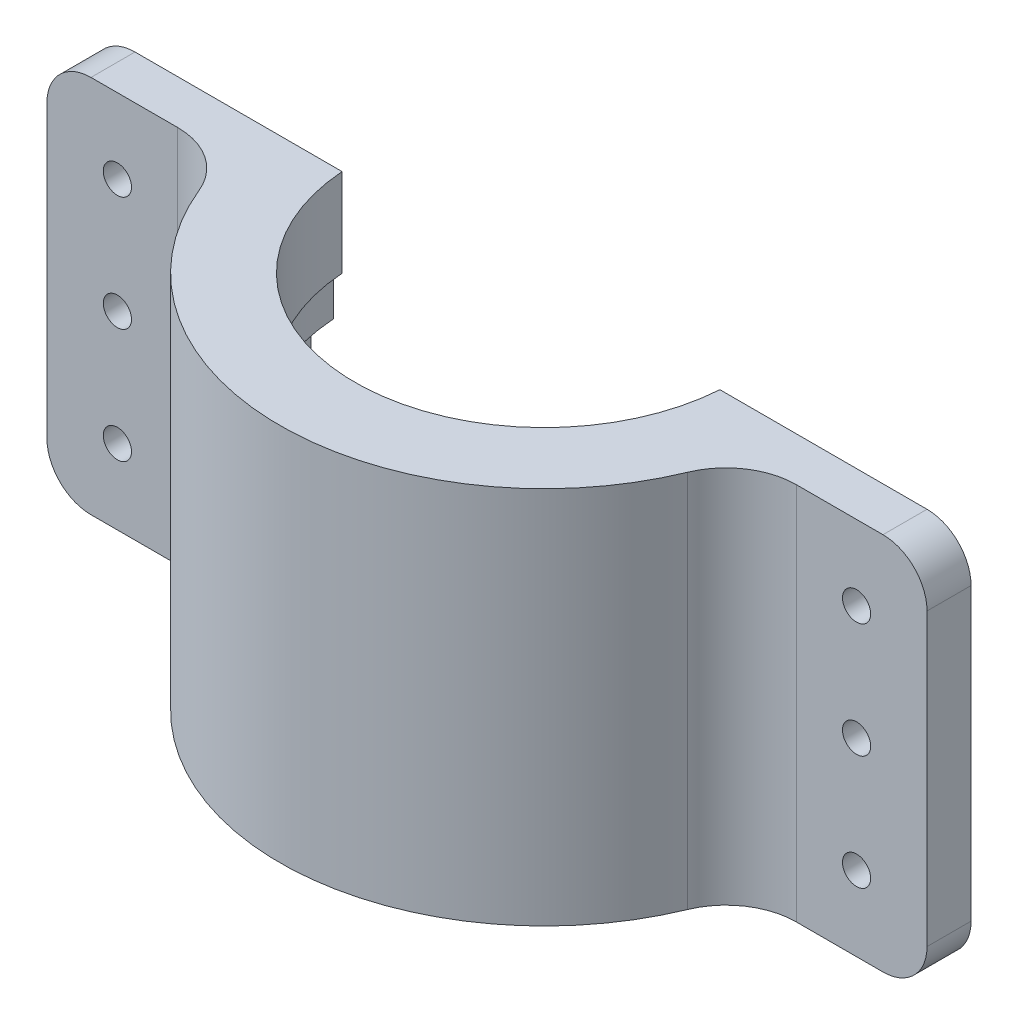
ISO-10303-21;
HEADER;
FILE_DESCRIPTION(('STEP AP214'),'2;1');
FILE_NAME('part.step','',(''),(''),'','','');
FILE_SCHEMA(('AUTOMOTIVE_DESIGN { 1 0 10303 214 1 1 1 1 }'));
ENDSEC;
DATA;
#1=APPLICATION_CONTEXT('core data for automotive mechanical design processes');
#2=APPLICATION_PROTOCOL_DEFINITION('international standard','automotive_design',2000,#1);
#3=PRODUCT_CONTEXT('',#1,'mechanical');
#4=PRODUCT('Part','Part','',(#3));
#5=PRODUCT_RELATED_PRODUCT_CATEGORY('part','',(#4));
#6=PRODUCT_DEFINITION_FORMATION('','',#4);
#7=PRODUCT_DEFINITION_CONTEXT('part definition',#1,'design');
#8=PRODUCT_DEFINITION('design','',#6,#7);
#9=PRODUCT_DEFINITION_SHAPE('','',#8);
#10=(LENGTH_UNIT() NAMED_UNIT(*) SI_UNIT(.MILLI.,.METRE.));
#11=(NAMED_UNIT(*) PLANE_ANGLE_UNIT() SI_UNIT($,.RADIAN.));
#12=(NAMED_UNIT(*) SI_UNIT($,.STERADIAN.) SOLID_ANGLE_UNIT());
#13=UNCERTAINTY_MEASURE_WITH_UNIT(LENGTH_MEASURE(1.E-05),#10,'distance_accuracy_value','');
#14=(GEOMETRIC_REPRESENTATION_CONTEXT(3) GLOBAL_UNCERTAINTY_ASSIGNED_CONTEXT((#13)) GLOBAL_UNIT_ASSIGNED_CONTEXT((#10,
#11,#12)) REPRESENTATION_CONTEXT('',''));
#15=CARTESIAN_POINT('',(0.,0.,0.));
#16=DIRECTION('',(0.,0.,1.));
#17=DIRECTION('',(1.,0.,0.));
#18=AXIS2_PLACEMENT_3D('',#15,#16,#17);
#19=CARTESIAN_POINT('',(0.,80.8792908083378,0.));
#20=DIRECTION('',(0.,1.,0.));
#21=DIRECTION('',(0.,0.,1.));
#22=AXIS2_PLACEMENT_3D('',#19,#20,#21);
#23=CYLINDRICAL_SURFACE('',#22,30.);
#24=CARTESIAN_POINT('',(0.,39.467251478359,0.));
#25=DIRECTION('',(0.,1.,0.));
#26=DIRECTION('',(0.,0.,1.));
#27=AXIS2_PLACEMENT_3D('',#24,#25,#26);
#28=CIRCLE('',#27,30.);
#29=CARTESIAN_POINT('',(-27.7300875626582,39.467251478359,11.4473684210524));
#30=VERTEX_POINT('',#29);
#31=CARTESIAN_POINT('',(27.7300875626581,39.467251478359,11.4473684210528));
#32=VERTEX_POINT('',#31);
#33=EDGE_CURVE('E409',#30,#32,#28,.T.);
#34=ORIENTED_EDGE('',*,*,#33,.F.);
#35=DIRECTION('',(0.,1.,0.));
#36=VECTOR('',#35,1.);
#37=CARTESIAN_POINT('',(-27.7300875626582,80.8792908083378,11.4473684210524));
#38=LINE('',#37,#36);
#39=CARTESIAN_POINT('',(-27.7300875626582,-3.53274852164102,11.4473684210524));
#40=VERTEX_POINT('',#39);
#41=EDGE_CURVE('E422',#30,#40,#38,.F.);
#42=ORIENTED_EDGE('',*,*,#41,.T.);
#43=CARTESIAN_POINT('',(0.,-3.53274852164102,0.));
#44=DIRECTION('',(0.,1.,0.));
#45=DIRECTION('',(0.,0.,1.));
#46=AXIS2_PLACEMENT_3D('',#43,#44,#45);
#47=CIRCLE('',#46,30.);
#48=CARTESIAN_POINT('',(27.7300875626581,-3.53274852164102,11.4473684210528));
#49=VERTEX_POINT('',#48);
#50=EDGE_CURVE('E406',#40,#49,#47,.T.);
#51=ORIENTED_EDGE('',*,*,#50,.T.);
#52=DIRECTION('',(0.,1.,0.));
#53=VECTOR('',#52,1.);
#54=CARTESIAN_POINT('',(27.7300875626581,80.8792908083378,11.4473684210528));
#55=LINE('',#54,#53);
#56=EDGE_CURVE('E420',#49,#32,#55,.T.);
#57=ORIENTED_EDGE('',*,*,#56,.T.);
#58=EDGE_LOOP('',(#34,#42,#51,#57));
#59=FACE_BOUND('',#58,.T.);
#60=ADVANCED_FACE('F43',(#59),#23,.T.);
#61=CARTESIAN_POINT('',(0.,80.8792908083378,0.));
#62=DIRECTION('',(0.,1.,0.));
#63=DIRECTION('',(0.,0.,1.));
#64=AXIS2_PLACEMENT_3D('',#61,#62,#63);
#65=CYLINDRICAL_SURFACE('',#64,21.5);
#66=DIRECTION('',(0.,1.,0.));
#67=VECTOR('',#66,1.);
#68=CARTESIAN_POINT('',(-21.4476105895272,80.8792908083378,1.49999999999985));
#69=LINE('',#68,#67);
#70=CARTESIAN_POINT('',(-21.4476105895272,39.467251478359,1.49999999999985));
#71=VERTEX_POINT('',#70);
#72=CARTESIAN_POINT('',(-21.4476105895272,29.467251478359,1.49999999999985));
#73=VERTEX_POINT('',#72);
#74=EDGE_CURVE('E350',#71,#73,#69,.F.);
#75=ORIENTED_EDGE('',*,*,#74,.F.);
#76=CARTESIAN_POINT('',(0.,39.467251478359,0.));
#77=DIRECTION('',(0.,1.,0.));
#78=DIRECTION('',(0.,0.,1.));
#79=AXIS2_PLACEMENT_3D('',#76,#77,#78);
#80=CIRCLE('',#79,21.5);
#81=CARTESIAN_POINT('',(21.4476105895272,39.467251478359,1.50000000000015));
#82=VERTEX_POINT('',#81);
#83=EDGE_CURVE('E411',#71,#82,#80,.T.);
#84=ORIENTED_EDGE('',*,*,#83,.T.);
#85=DIRECTION('',(0.,1.,0.));
#86=VECTOR('',#85,1.);
#87=CARTESIAN_POINT('',(21.4476105895272,80.8792908083378,1.50000000000015));
#88=LINE('',#87,#86);
#89=CARTESIAN_POINT('',(21.4476105895272,29.467251478359,1.50000000000015));
#90=VERTEX_POINT('',#89);
#91=EDGE_CURVE('E365',#90,#82,#88,.T.);
#92=ORIENTED_EDGE('',*,*,#91,.F.);
#93=CARTESIAN_POINT('',(0.,29.467251478359,0.));
#94=DIRECTION('',(0.,1.,0.));
#95=DIRECTION('',(0.,0.,1.));
#96=AXIS2_PLACEMENT_3D('',#93,#94,#95);
#97=CIRCLE('',#96,21.5);
#98=EDGE_CURVE('E367',#73,#90,#97,.T.);
#99=ORIENTED_EDGE('',*,*,#98,.F.);
#100=EDGE_LOOP('',(#75,#84,#92,#99));
#101=FACE_BOUND('',#100,.T.);
#102=ADVANCED_FACE('F518',(#101),#65,.F.);
#103=CARTESIAN_POINT('',(-21.5,39.467251478359,-1.50133697570255E-13));
#104=DIRECTION('',(0.,-1.,0.));
#105=DIRECTION('',(0.,0.,-1.));
#106=AXIS2_PLACEMENT_3D('',#103,#104,#105);
#107=PLANE('',#106);
#108=DIRECTION('',(0.,0.,-1.));
#109=VECTOR('',#108,1.);
#110=CARTESIAN_POINT('',(44.9624765331572,39.467251478359,6.50000000000031));
#111=LINE('',#110,#109);
#112=CARTESIAN_POINT('',(44.9624765331572,39.467251478359,6.50000000000031));
#113=VERTEX_POINT('',#112);
#114=CARTESIAN_POINT('',(44.9624765331573,39.467251478359,1.50000000000031));
#115=VERTEX_POINT('',#114);
#116=EDGE_CURVE('E217',#113,#115,#111,.T.);
#117=ORIENTED_EDGE('',*,*,#116,.T.);
#118=DIRECTION('',(1.,0.,0.));
#119=VECTOR('',#118,1.);
#120=CARTESIAN_POINT('',(-21.5,39.467251478359,1.49999999999985));
#121=LINE('',#120,#119);
#122=EDGE_CURVE('E351',#82,#115,#121,.T.);
#123=ORIENTED_EDGE('',*,*,#122,.F.);
#124=ORIENTED_EDGE('',*,*,#83,.F.);
#125=CARTESIAN_POINT('',(-44.9624765331573,39.467251478359,1.49999999999969));
#126=VERTEX_POINT('',#125);
#127=EDGE_CURVE('E347',#126,#71,#121,.T.);
#128=ORIENTED_EDGE('',*,*,#127,.F.);
#129=DIRECTION('',(0.,0.,-1.));
#130=VECTOR('',#129,1.);
#131=CARTESIAN_POINT('',(-44.9624765331573,39.467251478359,6.49999999999969));
#132=LINE('',#131,#130);
#133=CARTESIAN_POINT('',(-44.9624765331573,39.467251478359,6.49999999999969));
#134=VERTEX_POINT('',#133);
#135=EDGE_CURVE('E311',#134,#126,#132,.T.);
#136=ORIENTED_EDGE('',*,*,#135,.F.);
#137=DIRECTION('',(-1.,0.,0.));
#138=VECTOR('',#137,1.);
#139=CARTESIAN_POINT('',(0.,39.467251478359,6.5));
#140=LINE('',#139,#138);
#141=CARTESIAN_POINT('',(-35.124777579367,39.467251478359,6.49999999999975));
#142=VERTEX_POINT('',#141);
#143=EDGE_CURVE('E281',#142,#134,#140,.T.);
#144=ORIENTED_EDGE('',*,*,#143,.F.);
#145=CARTESIAN_POINT('',(-35.1247775793671,39.467251478359,14.4999999999998));
#146=DIRECTION('',(0.,-1.,0.));
#147=DIRECTION('',(0.,0.,-1.));
#148=AXIS2_PLACEMENT_3D('',#145,#146,#147);
#149=CIRCLE('',#148,8.);
#150=EDGE_CURVE('E426',#142,#30,#149,.T.);
#151=ORIENTED_EDGE('',*,*,#150,.T.);
#152=ORIENTED_EDGE('',*,*,#33,.T.);
#153=CARTESIAN_POINT('',(35.1247775793669,39.467251478359,14.5000000000002));
#154=DIRECTION('',(0.,-1.,0.));
#155=DIRECTION('',(0.,0.,-1.));
#156=AXIS2_PLACEMENT_3D('',#153,#154,#155);
#157=CIRCLE('',#156,8.);
#158=CARTESIAN_POINT('',(35.1247775793669,39.467251478359,6.50000000000025));
#159=VERTEX_POINT('',#158);
#160=EDGE_CURVE('E11',#32,#159,#157,.T.);
#161=ORIENTED_EDGE('',*,*,#160,.T.);
#162=DIRECTION('',(1.,0.,0.));
#163=VECTOR('',#162,1.);
#164=CARTESIAN_POINT('',(0.,39.467251478359,6.5));
#165=LINE('',#164,#163);
#166=EDGE_CURVE('E213',#159,#113,#165,.T.);
#167=ORIENTED_EDGE('',*,*,#166,.T.);
#168=EDGE_LOOP('',(#117,#123,#124,#128,#136,#144,#151,#152,#161,#167));
#169=FACE_BOUND('',#168,.T.);
#170=ADVANCED_FACE('F215',(#169),#107,.F.);
#171=CARTESIAN_POINT('',(-21.5,-3.53274852164102,-1.50133697570255E-13));
#172=DIRECTION('',(0.,1.,0.));
#173=DIRECTION('',(0.,0.,1.));
#174=AXIS2_PLACEMENT_3D('',#171,#172,#173);
#175=PLANE('',#174);
#176=CARTESIAN_POINT('',(0.,-3.53274852164102,0.));
#177=DIRECTION('',(0.,1.,0.));
#178=DIRECTION('',(0.,0.,1.));
#179=AXIS2_PLACEMENT_3D('',#176,#177,#178);
#180=CIRCLE('',#179,21.5);
#181=CARTESIAN_POINT('',(-21.4476105895272,-3.53274852164102,1.49999999999985));
#182=VERTEX_POINT('',#181);
#183=CARTESIAN_POINT('',(21.4476105895272,-3.53274852164102,1.50000000000015));
#184=VERTEX_POINT('',#183);
#185=EDGE_CURVE('E403',#182,#184,#180,.T.);
#186=ORIENTED_EDGE('',*,*,#185,.T.);
#187=DIRECTION('',(-1.,0.,0.));
#188=VECTOR('',#187,1.);
#189=CARTESIAN_POINT('',(-21.5,-3.53274852164102,1.49999999999985));
#190=LINE('',#189,#188);
#191=CARTESIAN_POINT('',(44.9624765331573,-3.53274852164102,1.50000000000031));
#192=VERTEX_POINT('',#191);
#193=EDGE_CURVE('E348',#192,#184,#190,.T.);
#194=ORIENTED_EDGE('',*,*,#193,.F.);
#195=DIRECTION('',(0.,0.,-1.));
#196=VECTOR('',#195,1.);
#197=CARTESIAN_POINT('',(44.9624765331572,-3.53274852164102,6.50000000000031));
#198=LINE('',#197,#196);
#199=CARTESIAN_POINT('',(44.9624765331572,-3.53274852164102,6.50000000000031));
#200=VERTEX_POINT('',#199);
#201=EDGE_CURVE('E263',#200,#192,#198,.T.);
#202=ORIENTED_EDGE('',*,*,#201,.F.);
#203=DIRECTION('',(-1.,0.,0.));
#204=VECTOR('',#203,1.);
#205=CARTESIAN_POINT('',(0.,-3.53274852164102,6.5));
#206=LINE('',#205,#204);
#207=CARTESIAN_POINT('',(35.1247775793669,-3.53274852164102,6.50000000000025));
#208=VERTEX_POINT('',#207);
#209=EDGE_CURVE('E230',#200,#208,#206,.T.);
#210=ORIENTED_EDGE('',*,*,#209,.T.);
#211=CARTESIAN_POINT('',(35.1247775793669,-3.53274852164102,14.5000000000002));
#212=DIRECTION('',(0.,1.,0.));
#213=DIRECTION('',(0.,0.,1.));
#214=AXIS2_PLACEMENT_3D('',#211,#212,#213);
#215=CIRCLE('',#214,8.);
#216=EDGE_CURVE('E51',#208,#49,#215,.T.);
#217=ORIENTED_EDGE('',*,*,#216,.T.);
#218=ORIENTED_EDGE('',*,*,#50,.F.);
#219=CARTESIAN_POINT('',(-35.1247775793671,-3.53274852164102,14.4999999999998));
#220=DIRECTION('',(0.,1.,0.));
#221=DIRECTION('',(0.,0.,1.));
#222=AXIS2_PLACEMENT_3D('',#219,#220,#221);
#223=CIRCLE('',#222,8.);
#224=CARTESIAN_POINT('',(-35.124777579367,-3.53274852164102,6.49999999999975));
#225=VERTEX_POINT('',#224);
#226=EDGE_CURVE('E428',#40,#225,#223,.T.);
#227=ORIENTED_EDGE('',*,*,#226,.T.);
#228=DIRECTION('',(1.,0.,0.));
#229=VECTOR('',#228,1.);
#230=CARTESIAN_POINT('',(0.,-3.53274852164102,6.5));
#231=LINE('',#230,#229);
#232=CARTESIAN_POINT('',(-44.9624765331573,-3.53274852164101,6.49999999999969));
#233=VERTEX_POINT('',#232);
#234=EDGE_CURVE('E283',#233,#225,#231,.T.);
#235=ORIENTED_EDGE('',*,*,#234,.F.);
#236=DIRECTION('',(0.,0.,-1.));
#237=VECTOR('',#236,1.);
#238=CARTESIAN_POINT('',(-44.9624765331573,-3.53274852164101,6.49999999999969));
#239=LINE('',#238,#237);
#240=CARTESIAN_POINT('',(-44.9624765331573,-3.53274852164101,1.49999999999969));
#241=VERTEX_POINT('',#240);
#242=EDGE_CURVE('E307',#233,#241,#239,.T.);
#243=ORIENTED_EDGE('',*,*,#242,.T.);
#244=EDGE_CURVE('E345',#182,#241,#190,.T.);
#245=ORIENTED_EDGE('',*,*,#244,.F.);
#246=EDGE_LOOP('',(#186,#194,#202,#210,#217,#218,#227,#235,#243,#245));
#247=FACE_BOUND('',#246,.T.);
#248=ADVANCED_FACE('F431',(#247),#175,.F.);
#249=CARTESIAN_POINT('',(0.,80.8792908083378,0.));
#250=DIRECTION('',(0.,1.,0.));
#251=DIRECTION('',(0.,0.,1.));
#252=AXIS2_PLACEMENT_3D('',#249,#250,#251);
#253=CYLINDRICAL_SURFACE('',#252,21.5);
#254=DIRECTION('',(0.,1.,0.));
#255=VECTOR('',#254,1.);
#256=CARTESIAN_POINT('',(-21.4476105895272,80.8792908083378,1.49999999999985));
#257=LINE('',#256,#255);
#258=CARTESIAN_POINT('',(-21.4476105895272,4.46725147835898,1.49999999999985));
#259=VERTEX_POINT('',#258);
#260=EDGE_CURVE('E342',#259,#182,#257,.F.);
#261=ORIENTED_EDGE('',*,*,#260,.F.);
#262=CARTESIAN_POINT('',(0.,4.46725147835898,0.));
#263=DIRECTION('',(0.,1.,0.));
#264=DIRECTION('',(0.,0.,1.));
#265=AXIS2_PLACEMENT_3D('',#262,#263,#264);
#266=CIRCLE('',#265,21.5);
#267=CARTESIAN_POINT('',(21.4476105895272,4.46725147835898,1.50000000000015));
#268=VERTEX_POINT('',#267);
#269=EDGE_CURVE('E400',#259,#268,#266,.T.);
#270=ORIENTED_EDGE('',*,*,#269,.T.);
#271=DIRECTION('',(0.,1.,0.));
#272=VECTOR('',#271,1.);
#273=CARTESIAN_POINT('',(21.4476105895272,80.8792908083378,1.50000000000015));
#274=LINE('',#273,#272);
#275=EDGE_CURVE('E363',#184,#268,#274,.T.);
#276=ORIENTED_EDGE('',*,*,#275,.F.);
#277=ORIENTED_EDGE('',*,*,#185,.F.);
#278=EDGE_LOOP('',(#261,#270,#276,#277));
#279=FACE_BOUND('',#278,.T.);
#280=ADVANCED_FACE('F453',(#279),#253,.F.);
#281=CARTESIAN_POINT('',(-22.5,4.46725147835898,-1.57116660247941E-13));
#282=DIRECTION('',(0.,-1.,0.));
#283=DIRECTION('',(0.,0.,-1.));
#284=AXIS2_PLACEMENT_3D('',#281,#282,#283);
#285=PLANE('',#284);
#286=DIRECTION('',(1.,0.,0.));
#287=VECTOR('',#286,1.);
#288=CARTESIAN_POINT('',(-22.5,4.46725147835898,1.49999999999984));
#289=LINE('',#288,#287);
#290=CARTESIAN_POINT('',(-22.4499443206437,4.46725147835898,1.49999999999984));
#291=VERTEX_POINT('',#290);
#292=EDGE_CURVE('E340',#291,#259,#289,.T.);
#293=ORIENTED_EDGE('',*,*,#292,.F.);
#294=CARTESIAN_POINT('',(0.,4.46725147835898,0.));
#295=DIRECTION('',(0.,1.,0.));
#296=DIRECTION('',(0.,0.,1.));
#297=AXIS2_PLACEMENT_3D('',#294,#295,#296);
#298=CIRCLE('',#297,22.5);
#299=CARTESIAN_POINT('',(22.4499443206436,4.46725147835898,1.50000000000016));
#300=VERTEX_POINT('',#299);
#301=EDGE_CURVE('E397',#291,#300,#298,.T.);
#302=ORIENTED_EDGE('',*,*,#301,.T.);
#303=EDGE_CURVE('E343',#268,#300,#289,.T.);
#304=ORIENTED_EDGE('',*,*,#303,.F.);
#305=ORIENTED_EDGE('',*,*,#269,.F.);
#306=EDGE_LOOP('',(#293,#302,#304,#305));
#307=FACE_BOUND('',#306,.T.);
#308=ADVANCED_FACE('F464',(#307),#285,.F.);
#309=CARTESIAN_POINT('',(0.,80.8792908083378,0.));
#310=DIRECTION('',(0.,1.,0.));
#311=DIRECTION('',(0.,0.,1.));
#312=AXIS2_PLACEMENT_3D('',#309,#310,#311);
#313=CYLINDRICAL_SURFACE('',#312,22.5);
#314=DIRECTION('',(0.,1.,0.));
#315=VECTOR('',#314,1.);
#316=CARTESIAN_POINT('',(-22.4499443206437,80.8792908083378,1.49999999999984));
#317=LINE('',#316,#315);
#318=CARTESIAN_POINT('',(-22.4499443206437,9.46725147835897,1.49999999999984));
#319=VERTEX_POINT('',#318);
#320=EDGE_CURVE('E337',#319,#291,#317,.F.);
#321=ORIENTED_EDGE('',*,*,#320,.F.);
#322=CARTESIAN_POINT('',(0.,9.46725147835897,0.));
#323=DIRECTION('',(0.,1.,0.));
#324=DIRECTION('',(0.,0.,1.));
#325=AXIS2_PLACEMENT_3D('',#322,#323,#324);
#326=CIRCLE('',#325,22.5);
#327=CARTESIAN_POINT('',(22.4499443206436,9.46725147835897,1.50000000000016));
#328=VERTEX_POINT('',#327);
#329=EDGE_CURVE('E394',#319,#328,#326,.T.);
#330=ORIENTED_EDGE('',*,*,#329,.T.);
#331=DIRECTION('',(0.,1.,0.));
#332=VECTOR('',#331,1.);
#333=CARTESIAN_POINT('',(22.4499443206436,80.8792908083378,1.50000000000016));
#334=LINE('',#333,#332);
#335=EDGE_CURVE('E361',#300,#328,#334,.T.);
#336=ORIENTED_EDGE('',*,*,#335,.F.);
#337=ORIENTED_EDGE('',*,*,#301,.F.);
#338=EDGE_LOOP('',(#321,#330,#336,#337));
#339=FACE_BOUND('',#338,.T.);
#340=ADVANCED_FACE('F470',(#339),#313,.F.);
#341=CARTESIAN_POINT('',(-25.,9.46725147835898,-1.74574066942157E-13));
#342=DIRECTION('',(0.,-1.,0.));
#343=DIRECTION('',(0.,0.,-1.));
#344=AXIS2_PLACEMENT_3D('',#341,#342,#343);
#345=PLANE('',#344);
#346=DIRECTION('',(1.,0.,0.));
#347=VECTOR('',#346,1.);
#348=CARTESIAN_POINT('',(-25.,9.46725147835898,1.49999999999983));
#349=LINE('',#348,#347);
#350=CARTESIAN_POINT('',(-24.9549594269356,9.46725147835897,1.49999999999983));
#351=VERTEX_POINT('',#350);
#352=EDGE_CURVE('E335',#351,#319,#349,.T.);
#353=ORIENTED_EDGE('',*,*,#352,.F.);
#354=CARTESIAN_POINT('',(0.,9.46725147835897,0.));
#355=DIRECTION('',(0.,1.,0.));
#356=DIRECTION('',(0.,0.,1.));
#357=AXIS2_PLACEMENT_3D('',#354,#355,#356);
#358=CIRCLE('',#357,25.);
#359=CARTESIAN_POINT('',(24.9549594269356,9.46725147835897,1.50000000000017));
#360=VERTEX_POINT('',#359);
#361=EDGE_CURVE('E391',#351,#360,#358,.T.);
#362=ORIENTED_EDGE('',*,*,#361,.T.);
#363=EDGE_CURVE('E338',#328,#360,#349,.T.);
#364=ORIENTED_EDGE('',*,*,#363,.F.);
#365=ORIENTED_EDGE('',*,*,#329,.F.);
#366=EDGE_LOOP('',(#353,#362,#364,#365));
#367=FACE_BOUND('',#366,.T.);
#368=ADVANCED_FACE('F474',(#367),#345,.F.);
#369=CARTESIAN_POINT('',(0.,80.8792908083378,0.));
#370=DIRECTION('',(0.,1.,0.));
#371=DIRECTION('',(0.,0.,1.));
#372=AXIS2_PLACEMENT_3D('',#369,#370,#371);
#373=CYLINDRICAL_SURFACE('',#372,25.);
#374=DIRECTION('',(0.,1.,0.));
#375=VECTOR('',#374,1.);
#376=CARTESIAN_POINT('',(-24.9549594269356,80.8792908083378,1.49999999999983));
#377=LINE('',#376,#375);
#378=CARTESIAN_POINT('',(-24.9549594269356,14.467251478359,1.49999999999983));
#379=VERTEX_POINT('',#378);
#380=EDGE_CURVE('E332',#379,#351,#377,.F.);
#381=ORIENTED_EDGE('',*,*,#380,.F.);
#382=CARTESIAN_POINT('',(0.,14.467251478359,0.));
#383=DIRECTION('',(0.,1.,0.));
#384=DIRECTION('',(0.,0.,1.));
#385=AXIS2_PLACEMENT_3D('',#382,#383,#384);
#386=CIRCLE('',#385,25.);
#387=CARTESIAN_POINT('',(24.9549594269356,14.467251478359,1.50000000000017));
#388=VERTEX_POINT('',#387);
#389=EDGE_CURVE('E388',#379,#388,#386,.T.);
#390=ORIENTED_EDGE('',*,*,#389,.T.);
#391=DIRECTION('',(0.,1.,0.));
#392=VECTOR('',#391,1.);
#393=CARTESIAN_POINT('',(24.9549594269356,80.8792908083378,1.50000000000017));
#394=LINE('',#393,#392);
#395=EDGE_CURVE('E359',#360,#388,#394,.T.);
#396=ORIENTED_EDGE('',*,*,#395,.F.);
#397=ORIENTED_EDGE('',*,*,#361,.F.);
#398=EDGE_LOOP('',(#381,#390,#396,#397));
#399=FACE_BOUND('',#398,.T.);
#400=ADVANCED_FACE('F480',(#399),#373,.F.);
#401=CARTESIAN_POINT('',(-22.5,14.467251478359,-1.57116660247941E-13));
#402=DIRECTION('',(0.,1.,0.));
#403=DIRECTION('',(0.,0.,1.));
#404=AXIS2_PLACEMENT_3D('',#401,#402,#403);
#405=PLANE('',#404);
#406=DIRECTION('',(-1.,0.,0.));
#407=VECTOR('',#406,1.);
#408=CARTESIAN_POINT('',(-22.5,14.467251478359,1.49999999999984));
#409=LINE('',#408,#407);
#410=CARTESIAN_POINT('',(22.4499443206436,14.467251478359,1.50000000000016));
#411=VERTEX_POINT('',#410);
#412=EDGE_CURVE('E333',#388,#411,#409,.T.);
#413=ORIENTED_EDGE('',*,*,#412,.F.);
#414=ORIENTED_EDGE('',*,*,#389,.F.);
#415=CARTESIAN_POINT('',(-22.4499443206437,14.467251478359,1.49999999999984));
#416=VERTEX_POINT('',#415);
#417=EDGE_CURVE('E330',#416,#379,#409,.T.);
#418=ORIENTED_EDGE('',*,*,#417,.F.);
#419=CARTESIAN_POINT('',(0.,14.467251478359,0.));
#420=DIRECTION('',(0.,1.,0.));
#421=DIRECTION('',(0.,0.,1.));
#422=AXIS2_PLACEMENT_3D('',#419,#420,#421);
#423=CIRCLE('',#422,22.5);
#424=EDGE_CURVE('E385',#416,#411,#423,.T.);
#425=ORIENTED_EDGE('',*,*,#424,.T.);
#426=EDGE_LOOP('',(#413,#414,#418,#425));
#427=FACE_BOUND('',#426,.T.);
#428=ADVANCED_FACE('F484',(#427),#405,.F.);
#429=CARTESIAN_POINT('',(0.,80.8792908083378,0.));
#430=DIRECTION('',(0.,1.,0.));
#431=DIRECTION('',(0.,0.,1.));
#432=AXIS2_PLACEMENT_3D('',#429,#430,#431);
#433=CYLINDRICAL_SURFACE('',#432,22.5);
#434=DIRECTION('',(0.,1.,0.));
#435=VECTOR('',#434,1.);
#436=CARTESIAN_POINT('',(-22.4499443206437,80.8792908083378,1.49999999999984));
#437=LINE('',#436,#435);
#438=CARTESIAN_POINT('',(-22.4499443206437,19.467251478359,1.49999999999984));
#439=VERTEX_POINT('',#438);
#440=EDGE_CURVE('E327',#439,#416,#437,.F.);
#441=ORIENTED_EDGE('',*,*,#440,.F.);
#442=CARTESIAN_POINT('',(0.,19.467251478359,0.));
#443=DIRECTION('',(0.,1.,0.));
#444=DIRECTION('',(0.,0.,1.));
#445=AXIS2_PLACEMENT_3D('',#442,#443,#444);
#446=CIRCLE('',#445,22.5);
#447=CARTESIAN_POINT('',(22.4499443206436,19.467251478359,1.50000000000016));
#448=VERTEX_POINT('',#447);
#449=EDGE_CURVE('E382',#439,#448,#446,.T.);
#450=ORIENTED_EDGE('',*,*,#449,.T.);
#451=DIRECTION('',(0.,1.,0.));
#452=VECTOR('',#451,1.);
#453=CARTESIAN_POINT('',(22.4499443206436,80.8792908083378,1.50000000000016));
#454=LINE('',#453,#452);
#455=EDGE_CURVE('E357',#411,#448,#454,.T.);
#456=ORIENTED_EDGE('',*,*,#455,.F.);
#457=ORIENTED_EDGE('',*,*,#424,.F.);
#458=EDGE_LOOP('',(#441,#450,#456,#457));
#459=FACE_BOUND('',#458,.T.);
#460=ADVANCED_FACE('F490',(#459),#433,.F.);
#461=CARTESIAN_POINT('',(-25.,19.467251478359,-1.74574066942157E-13));
#462=DIRECTION('',(0.,-1.,0.));
#463=DIRECTION('',(0.,0.,-1.));
#464=AXIS2_PLACEMENT_3D('',#461,#462,#463);
#465=PLANE('',#464);
#466=DIRECTION('',(1.,0.,0.));
#467=VECTOR('',#466,1.);
#468=CARTESIAN_POINT('',(-25.,19.467251478359,1.49999999999983));
#469=LINE('',#468,#467);
#470=CARTESIAN_POINT('',(-24.9549594269356,19.467251478359,1.49999999999983));
#471=VERTEX_POINT('',#470);
#472=EDGE_CURVE('E325',#471,#439,#469,.T.);
#473=ORIENTED_EDGE('',*,*,#472,.F.);
#474=CARTESIAN_POINT('',(0.,19.467251478359,0.));
#475=DIRECTION('',(0.,1.,0.));
#476=DIRECTION('',(0.,0.,1.));
#477=AXIS2_PLACEMENT_3D('',#474,#475,#476);
#478=CIRCLE('',#477,25.);
#479=CARTESIAN_POINT('',(24.9549594269356,19.467251478359,1.50000000000017));
#480=VERTEX_POINT('',#479);
#481=EDGE_CURVE('E379',#471,#480,#478,.T.);
#482=ORIENTED_EDGE('',*,*,#481,.T.);
#483=EDGE_CURVE('E328',#448,#480,#469,.T.);
#484=ORIENTED_EDGE('',*,*,#483,.F.);
#485=ORIENTED_EDGE('',*,*,#449,.F.);
#486=EDGE_LOOP('',(#473,#482,#484,#485));
#487=FACE_BOUND('',#486,.T.);
#488=ADVANCED_FACE('F494',(#487),#465,.F.);
#489=CARTESIAN_POINT('',(0.,80.8792908083378,0.));
#490=DIRECTION('',(0.,1.,0.));
#491=DIRECTION('',(0.,0.,1.));
#492=AXIS2_PLACEMENT_3D('',#489,#490,#491);
#493=CYLINDRICAL_SURFACE('',#492,25.);
#494=DIRECTION('',(0.,1.,0.));
#495=VECTOR('',#494,1.);
#496=CARTESIAN_POINT('',(-24.9549594269356,80.8792908083378,1.49999999999983));
#497=LINE('',#496,#495);
#498=CARTESIAN_POINT('',(-24.9549594269356,24.467251478359,1.49999999999983));
#499=VERTEX_POINT('',#498);
#500=EDGE_CURVE('E322',#499,#471,#497,.F.);
#501=ORIENTED_EDGE('',*,*,#500,.F.);
#502=CARTESIAN_POINT('',(0.,24.467251478359,0.));
#503=DIRECTION('',(0.,1.,0.));
#504=DIRECTION('',(0.,0.,1.));
#505=AXIS2_PLACEMENT_3D('',#502,#503,#504);
#506=CIRCLE('',#505,25.);
#507=CARTESIAN_POINT('',(24.9549594269356,24.467251478359,1.50000000000017));
#508=VERTEX_POINT('',#507);
#509=EDGE_CURVE('E376',#499,#508,#506,.T.);
#510=ORIENTED_EDGE('',*,*,#509,.T.);
#511=DIRECTION('',(0.,1.,0.));
#512=VECTOR('',#511,1.);
#513=CARTESIAN_POINT('',(24.9549594269356,80.8792908083378,1.50000000000017));
#514=LINE('',#513,#512);
#515=EDGE_CURVE('E355',#480,#508,#514,.T.);
#516=ORIENTED_EDGE('',*,*,#515,.F.);
#517=ORIENTED_EDGE('',*,*,#481,.F.);
#518=EDGE_LOOP('',(#501,#510,#516,#517));
#519=FACE_BOUND('',#518,.T.);
#520=ADVANCED_FACE('F500',(#519),#493,.F.);
#521=CARTESIAN_POINT('',(-22.5,24.467251478359,-1.57116660247941E-13));
#522=DIRECTION('',(0.,1.,0.));
#523=DIRECTION('',(0.,0.,1.));
#524=AXIS2_PLACEMENT_3D('',#521,#522,#523);
#525=PLANE('',#524);
#526=DIRECTION('',(-1.,0.,0.));
#527=VECTOR('',#526,1.);
#528=CARTESIAN_POINT('',(-22.5,24.467251478359,1.49999999999984));
#529=LINE('',#528,#527);
#530=CARTESIAN_POINT('',(22.4499443206436,24.467251478359,1.50000000000016));
#531=VERTEX_POINT('',#530);
#532=EDGE_CURVE('E323',#508,#531,#529,.T.);
#533=ORIENTED_EDGE('',*,*,#532,.F.);
#534=ORIENTED_EDGE('',*,*,#509,.F.);
#535=CARTESIAN_POINT('',(-22.4499443206437,24.467251478359,1.49999999999984));
#536=VERTEX_POINT('',#535);
#537=EDGE_CURVE('E320',#536,#499,#529,.T.);
#538=ORIENTED_EDGE('',*,*,#537,.F.);
#539=CARTESIAN_POINT('',(0.,24.467251478359,0.));
#540=DIRECTION('',(0.,1.,0.));
#541=DIRECTION('',(0.,0.,1.));
#542=AXIS2_PLACEMENT_3D('',#539,#540,#541);
#543=CIRCLE('',#542,22.5);
#544=EDGE_CURVE('E373',#536,#531,#543,.T.);
#545=ORIENTED_EDGE('',*,*,#544,.T.);
#546=EDGE_LOOP('',(#533,#534,#538,#545));
#547=FACE_BOUND('',#546,.T.);
#548=ADVANCED_FACE('F504',(#547),#525,.F.);
#549=CARTESIAN_POINT('',(0.,80.8792908083378,0.));
#550=DIRECTION('',(0.,1.,0.));
#551=DIRECTION('',(0.,0.,1.));
#552=AXIS2_PLACEMENT_3D('',#549,#550,#551);
#553=CYLINDRICAL_SURFACE('',#552,22.5);
#554=DIRECTION('',(0.,1.,0.));
#555=VECTOR('',#554,1.);
#556=CARTESIAN_POINT('',(-22.4499443206437,80.8792908083378,1.49999999999984));
#557=LINE('',#556,#555);
#558=CARTESIAN_POINT('',(-22.4499443206437,29.467251478359,1.49999999999984));
#559=VERTEX_POINT('',#558);
#560=EDGE_CURVE('E310',#559,#536,#557,.F.);
#561=ORIENTED_EDGE('',*,*,#560,.F.);
#562=CARTESIAN_POINT('',(0.,29.467251478359,0.));
#563=DIRECTION('',(0.,1.,0.));
#564=DIRECTION('',(0.,0.,1.));
#565=AXIS2_PLACEMENT_3D('',#562,#563,#564);
#566=CIRCLE('',#565,22.5);
#567=CARTESIAN_POINT('',(22.4499443206436,29.467251478359,1.50000000000016));
#568=VERTEX_POINT('',#567);
#569=EDGE_CURVE('E370',#559,#568,#566,.T.);
#570=ORIENTED_EDGE('',*,*,#569,.T.);
#571=DIRECTION('',(0.,1.,0.));
#572=VECTOR('',#571,1.);
#573=CARTESIAN_POINT('',(22.4499443206436,80.8792908083378,1.50000000000016));
#574=LINE('',#573,#572);
#575=EDGE_CURVE('E353',#531,#568,#574,.T.);
#576=ORIENTED_EDGE('',*,*,#575,.F.);
#577=ORIENTED_EDGE('',*,*,#544,.F.);
#578=EDGE_LOOP('',(#561,#570,#576,#577));
#579=FACE_BOUND('',#578,.T.);
#580=ADVANCED_FACE('F510',(#579),#553,.F.);
#581=CARTESIAN_POINT('',(-22.5,29.467251478359,-1.57116660247941E-13));
#582=DIRECTION('',(0.,1.,0.));
#583=DIRECTION('',(0.,0.,1.));
#584=AXIS2_PLACEMENT_3D('',#581,#582,#583);
#585=PLANE('',#584);
#586=DIRECTION('',(-1.,0.,0.));
#587=VECTOR('',#586,1.);
#588=CARTESIAN_POINT('',(-22.5,29.467251478359,1.49999999999984));
#589=LINE('',#588,#587);
#590=EDGE_CURVE('E416',#568,#90,#589,.T.);
#591=ORIENTED_EDGE('',*,*,#590,.F.);
#592=ORIENTED_EDGE('',*,*,#569,.F.);
#593=EDGE_CURVE('E414',#73,#559,#589,.T.);
#594=ORIENTED_EDGE('',*,*,#593,.F.);
#595=ORIENTED_EDGE('',*,*,#98,.T.);
#596=EDGE_LOOP('',(#591,#592,#594,#595));
#597=FACE_BOUND('',#596,.T.);
#598=ADVANCED_FACE('F514',(#597),#585,.F.);
#599=CARTESIAN_POINT('',(0.,0.,1.5));
#600=DIRECTION('',(0.,0.,-1.));
#601=DIRECTION('',(-1.,0.,0.));
#602=AXIS2_PLACEMENT_3D('',#599,#600,#601);
#603=PLANE('',#602);
#604=ORIENTED_EDGE('',*,*,#244,.T.);
#605=CARTESIAN_POINT('',(-44.9624765331573,1.46725147835899,1.49999999999969));
#606=DIRECTION('',(0.,0.,-1.));
#607=DIRECTION('',(-1.,0.,0.));
#608=AXIS2_PLACEMENT_3D('',#605,#606,#607);
#609=CIRCLE('',#608,5.);
#610=CARTESIAN_POINT('',(-49.9624765331573,1.46725147835899,1.49999999999965));
#611=VERTEX_POINT('',#610);
#612=EDGE_CURVE('E295',#611,#241,#609,.F.);
#613=ORIENTED_EDGE('',*,*,#612,.F.);
#614=DIRECTION('',(0.,-1.,0.));
#615=VECTOR('',#614,1.);
#616=CARTESIAN_POINT('',(-49.9624765331573,0.,1.49999999999965));
#617=LINE('',#616,#615);
#618=CARTESIAN_POINT('',(-49.9624765331573,34.467251478359,1.49999999999965));
#619=VERTEX_POINT('',#618);
#620=EDGE_CURVE('E298',#619,#611,#617,.T.);
#621=ORIENTED_EDGE('',*,*,#620,.F.);
#622=CARTESIAN_POINT('',(-44.9624765331573,34.467251478359,1.49999999999969));
#623=DIRECTION('',(0.,0.,-1.));
#624=DIRECTION('',(-1.,0.,0.));
#625=AXIS2_PLACEMENT_3D('',#622,#623,#624);
#626=CIRCLE('',#625,5.);
#627=EDGE_CURVE('E300',#126,#619,#626,.F.);
#628=ORIENTED_EDGE('',*,*,#627,.F.);
#629=ORIENTED_EDGE('',*,*,#127,.T.);
#630=ORIENTED_EDGE('',*,*,#74,.T.);
#631=ORIENTED_EDGE('',*,*,#593,.T.);
#632=ORIENTED_EDGE('',*,*,#560,.T.);
#633=ORIENTED_EDGE('',*,*,#537,.T.);
#634=ORIENTED_EDGE('',*,*,#500,.T.);
#635=ORIENTED_EDGE('',*,*,#472,.T.);
#636=ORIENTED_EDGE('',*,*,#440,.T.);
#637=ORIENTED_EDGE('',*,*,#417,.T.);
#638=ORIENTED_EDGE('',*,*,#380,.T.);
#639=ORIENTED_EDGE('',*,*,#352,.T.);
#640=ORIENTED_EDGE('',*,*,#320,.T.);
#641=ORIENTED_EDGE('',*,*,#292,.T.);
#642=ORIENTED_EDGE('',*,*,#260,.T.);
#643=EDGE_LOOP('',(#604,#613,#621,#628,#629,#630,#631,#632,#633,#634,#635,#636,#637,#638,#639,
#640,#641,#642));
#644=FACE_BOUND('',#643,.T.);
#645=CARTESIAN_POINT('',(-41.9624765331573,30.967251478359,1.49999999999971));
#646=DIRECTION('',(0.,0.,-1.));
#647=DIRECTION('',(-1.,0.,0.));
#648=AXIS2_PLACEMENT_3D('',#645,#646,#647);
#649=CIRCLE('',#648,1.6);
#650=CARTESIAN_POINT('',(-43.5624765331573,30.967251478359,1.4999999999997));
#651=VERTEX_POINT('',#650);
#652=EDGE_CURVE('E274',#651,#651,#649,.F.);
#653=ORIENTED_EDGE('',*,*,#652,.T.);
#654=EDGE_LOOP('',(#653));
#655=FACE_BOUND('',#654,.T.);
#656=CARTESIAN_POINT('',(-41.9624765331573,4.96725147835899,1.49999999999971));
#657=DIRECTION('',(0.,0.,-1.));
#658=DIRECTION('',(-1.,0.,0.));
#659=AXIS2_PLACEMENT_3D('',#656,#657,#658);
#660=CIRCLE('',#659,1.6);
#661=CARTESIAN_POINT('',(-43.5624765331573,4.96725147835899,1.4999999999997));
#662=VERTEX_POINT('',#661);
#663=EDGE_CURVE('E302',#662,#662,#660,.F.);
#664=ORIENTED_EDGE('',*,*,#663,.T.);
#665=EDGE_LOOP('',(#664));
#666=FACE_BOUND('',#665,.T.);
#667=CARTESIAN_POINT('',(-41.9624765331573,17.967251478359,1.49999999999971));
#668=DIRECTION('',(0.,0.,-1.));
#669=DIRECTION('',(-1.,0.,0.));
#670=AXIS2_PLACEMENT_3D('',#667,#668,#669);
#671=CIRCLE('',#670,1.6);
#672=CARTESIAN_POINT('',(-43.5624765331573,17.967251478359,1.4999999999997));
#673=VERTEX_POINT('',#672);
#674=EDGE_CURVE('E266',#673,#673,#671,.F.);
#675=ORIENTED_EDGE('',*,*,#674,.T.);
#676=EDGE_LOOP('',(#675));
#677=FACE_BOUND('',#676,.T.);
#678=ADVANCED_FACE('F459',(#644,#655,#666,#677),#603,.T.);
#679=ORIENTED_EDGE('',*,*,#193,.T.);
#680=ORIENTED_EDGE('',*,*,#275,.T.);
#681=ORIENTED_EDGE('',*,*,#303,.T.);
#682=ORIENTED_EDGE('',*,*,#335,.T.);
#683=ORIENTED_EDGE('',*,*,#363,.T.);
#684=ORIENTED_EDGE('',*,*,#395,.T.);
#685=ORIENTED_EDGE('',*,*,#412,.T.);
#686=ORIENTED_EDGE('',*,*,#455,.T.);
#687=ORIENTED_EDGE('',*,*,#483,.T.);
#688=ORIENTED_EDGE('',*,*,#515,.T.);
#689=ORIENTED_EDGE('',*,*,#532,.T.);
#690=ORIENTED_EDGE('',*,*,#575,.T.);
#691=ORIENTED_EDGE('',*,*,#590,.T.);
#692=ORIENTED_EDGE('',*,*,#91,.T.);
#693=ORIENTED_EDGE('',*,*,#122,.T.);
#694=CARTESIAN_POINT('',(44.9624765331573,34.467251478359,1.50000000000031));
#695=DIRECTION('',(0.,0.,-1.));
#696=DIRECTION('',(-1.,0.,0.));
#697=AXIS2_PLACEMENT_3D('',#694,#695,#696);
#698=CIRCLE('',#697,5.);
#699=CARTESIAN_POINT('',(49.9624765331573,34.467251478359,1.50000000000035));
#700=VERTEX_POINT('',#699);
#701=EDGE_CURVE('E228',#115,#700,#698,.T.);
#702=ORIENTED_EDGE('',*,*,#701,.T.);
#703=DIRECTION('',(0.,-1.,0.));
#704=VECTOR('',#703,1.);
#705=CARTESIAN_POINT('',(49.9624765331573,0.,1.50000000000035));
#706=LINE('',#705,#704);
#707=CARTESIAN_POINT('',(49.9624765331573,1.46725147835898,1.50000000000035));
#708=VERTEX_POINT('',#707);
#709=EDGE_CURVE('E256',#700,#708,#706,.T.);
#710=ORIENTED_EDGE('',*,*,#709,.T.);
#711=CARTESIAN_POINT('',(44.9624765331573,1.46725147835898,1.50000000000031));
#712=DIRECTION('',(0.,0.,-1.));
#713=DIRECTION('',(-1.,0.,0.));
#714=AXIS2_PLACEMENT_3D('',#711,#712,#713);
#715=CIRCLE('',#714,5.);
#716=EDGE_CURVE('E259',#708,#192,#715,.T.);
#717=ORIENTED_EDGE('',*,*,#716,.T.);
#718=EDGE_LOOP('',(#679,#680,#681,#682,#683,#684,#685,#686,#687,#688,#689,#690,#691,#692,#693,
#702,#710,#717));
#719=FACE_BOUND('',#718,.T.);
#720=CARTESIAN_POINT('',(41.9624765331573,4.96725147835897,1.50000000000029));
#721=DIRECTION('',(0.,0.,-1.));
#722=DIRECTION('',(-1.,0.,0.));
#723=AXIS2_PLACEMENT_3D('',#720,#721,#722);
#724=CIRCLE('',#723,1.6);
#725=CARTESIAN_POINT('',(40.3624765331573,4.96725147835897,1.50000000000028));
#726=VERTEX_POINT('',#725);
#727=EDGE_CURVE('E252',#726,#726,#724,.T.);
#728=ORIENTED_EDGE('',*,*,#727,.F.);
#729=EDGE_LOOP('',(#728));
#730=FACE_BOUND('',#729,.T.);
#731=CARTESIAN_POINT('',(41.9624765331573,17.967251478359,1.50000000000029));
#732=DIRECTION('',(0.,0.,-1.));
#733=DIRECTION('',(-1.,0.,0.));
#734=AXIS2_PLACEMENT_3D('',#731,#732,#733);
#735=CIRCLE('',#734,1.6);
#736=CARTESIAN_POINT('',(40.3624765331573,17.967251478359,1.50000000000028));
#737=VERTEX_POINT('',#736);
#738=EDGE_CURVE('E249',#737,#737,#735,.T.);
#739=ORIENTED_EDGE('',*,*,#738,.F.);
#740=EDGE_LOOP('',(#739));
#741=FACE_BOUND('',#740,.T.);
#742=CARTESIAN_POINT('',(41.9624765331573,30.967251478359,1.50000000000029));
#743=DIRECTION('',(0.,0.,-1.));
#744=DIRECTION('',(-1.,0.,0.));
#745=AXIS2_PLACEMENT_3D('',#742,#743,#744);
#746=CIRCLE('',#745,1.6);
#747=CARTESIAN_POINT('',(40.3624765331573,30.967251478359,1.50000000000028));
#748=VERTEX_POINT('',#747);
#749=EDGE_CURVE('E246',#748,#748,#746,.T.);
#750=ORIENTED_EDGE('',*,*,#749,.F.);
#751=EDGE_LOOP('',(#750));
#752=FACE_BOUND('',#751,.T.);
#753=ADVANCED_FACE('F444',(#719,#730,#741,#752),#603,.T.);
#754=CARTESIAN_POINT('',(0.,0.,6.5));
#755=DIRECTION('',(0.,0.,-1.));
#756=DIRECTION('',(-1.,0.,0.));
#757=AXIS2_PLACEMENT_3D('',#754,#755,#756);
#758=PLANE('',#757);
#759=CARTESIAN_POINT('',(-41.9624765331573,17.967251478359,6.49999999999971));
#760=DIRECTION('',(0.,0.,-1.));
#761=DIRECTION('',(-1.,0.,0.));
#762=AXIS2_PLACEMENT_3D('',#759,#760,#761);
#763=CIRCLE('',#762,1.6);
#764=CARTESIAN_POINT('',(-43.5624765331573,17.967251478359,6.4999999999997));
#765=VERTEX_POINT('',#764);
#766=EDGE_CURVE('E270',#765,#765,#763,.F.);
#767=ORIENTED_EDGE('',*,*,#766,.F.);
#768=EDGE_LOOP('',(#767));
#769=FACE_BOUND('',#768,.T.);
#770=CARTESIAN_POINT('',(-41.9624765331573,4.96725147835899,6.49999999999971));
#771=DIRECTION('',(0.,0.,-1.));
#772=DIRECTION('',(-1.,0.,0.));
#773=AXIS2_PLACEMENT_3D('',#770,#771,#772);
#774=CIRCLE('',#773,1.6);
#775=CARTESIAN_POINT('',(-43.5624765331573,4.96725147835899,6.4999999999997));
#776=VERTEX_POINT('',#775);
#777=EDGE_CURVE('E286',#776,#776,#774,.F.);
#778=ORIENTED_EDGE('',*,*,#777,.F.);
#779=EDGE_LOOP('',(#778));
#780=FACE_BOUND('',#779,.T.);
#781=CARTESIAN_POINT('',(-41.9624765331573,30.967251478359,6.49999999999971));
#782=DIRECTION('',(0.,0.,-1.));
#783=DIRECTION('',(-1.,0.,0.));
#784=AXIS2_PLACEMENT_3D('',#781,#782,#783);
#785=CIRCLE('',#784,1.6);
#786=CARTESIAN_POINT('',(-43.5624765331573,30.967251478359,6.4999999999997));
#787=VERTEX_POINT('',#786);
#788=EDGE_CURVE('E289',#787,#787,#785,.F.);
#789=ORIENTED_EDGE('',*,*,#788,.F.);
#790=EDGE_LOOP('',(#789));
#791=FACE_BOUND('',#790,.T.);
#792=ORIENTED_EDGE('',*,*,#234,.T.);
#793=DIRECTION('',(0.,-1.,0.));
#794=VECTOR('',#793,1.);
#795=CARTESIAN_POINT('',(-35.124777579367,39.467251478359,6.49999999999975));
#796=LINE('',#795,#794);
#797=EDGE_CURVE('E417',#225,#142,#796,.F.);
#798=ORIENTED_EDGE('',*,*,#797,.T.);
#799=ORIENTED_EDGE('',*,*,#143,.T.);
#800=CARTESIAN_POINT('',(-44.9624765331573,34.467251478359,6.49999999999969));
#801=DIRECTION('',(0.,0.,-1.));
#802=DIRECTION('',(-1.,0.,0.));
#803=AXIS2_PLACEMENT_3D('',#800,#801,#802);
#804=CIRCLE('',#803,5.);
#805=CARTESIAN_POINT('',(-49.9624765331573,34.467251478359,6.49999999999965));
#806=VERTEX_POINT('',#805);
#807=EDGE_CURVE('E279',#134,#806,#804,.F.);
#808=ORIENTED_EDGE('',*,*,#807,.T.);
#809=DIRECTION('',(0.,-1.,0.));
#810=VECTOR('',#809,1.);
#811=CARTESIAN_POINT('',(-49.9624765331573,0.,6.49999999999965));
#812=LINE('',#811,#810);
#813=CARTESIAN_POINT('',(-49.9624765331573,1.46725147835899,6.49999999999965));
#814=VERTEX_POINT('',#813);
#815=EDGE_CURVE('E277',#806,#814,#812,.T.);
#816=ORIENTED_EDGE('',*,*,#815,.T.);
#817=CARTESIAN_POINT('',(-44.9624765331573,1.46725147835899,6.49999999999969));
#818=DIRECTION('',(0.,0.,-1.));
#819=DIRECTION('',(-1.,0.,0.));
#820=AXIS2_PLACEMENT_3D('',#817,#818,#819);
#821=CIRCLE('',#820,5.);
#822=EDGE_CURVE('E273',#814,#233,#821,.F.);
#823=ORIENTED_EDGE('',*,*,#822,.T.);
#824=EDGE_LOOP('',(#792,#798,#799,#808,#816,#823));
#825=FACE_BOUND('',#824,.T.);
#826=ADVANCED_FACE('F534',(#769,#780,#791,#825),#758,.F.);
#827=CARTESIAN_POINT('',(-44.9624765331573,1.46725147835899,6.49999999999969));
#828=DIRECTION('',(0.,0.,-1.));
#829=DIRECTION('',(-1.,0.,0.));
#830=AXIS2_PLACEMENT_3D('',#827,#828,#829);
#831=CYLINDRICAL_SURFACE('',#830,5.);
#832=ORIENTED_EDGE('',*,*,#612,.T.);
#833=ORIENTED_EDGE('',*,*,#242,.F.);
#834=ORIENTED_EDGE('',*,*,#822,.F.);
#835=DIRECTION('',(0.,0.,-1.));
#836=VECTOR('',#835,1.);
#837=CARTESIAN_POINT('',(-49.9624765331573,1.46725147835899,6.49999999999965));
#838=LINE('',#837,#836);
#839=EDGE_CURVE('E292',#814,#611,#838,.T.);
#840=ORIENTED_EDGE('',*,*,#839,.T.);
#841=EDGE_LOOP('',(#832,#833,#834,#840));
#842=FACE_BOUND('',#841,.T.);
#843=ADVANCED_FACE('F532',(#842),#831,.T.);
#844=CARTESIAN_POINT('',(-44.9624765331573,34.467251478359,6.49999999999969));
#845=DIRECTION('',(0.,0.,-1.));
#846=DIRECTION('',(-1.,0.,0.));
#847=AXIS2_PLACEMENT_3D('',#844,#845,#846);
#848=CYLINDRICAL_SURFACE('',#847,5.);
#849=ORIENTED_EDGE('',*,*,#627,.T.);
#850=DIRECTION('',(0.,0.,-1.));
#851=VECTOR('',#850,1.);
#852=CARTESIAN_POINT('',(-49.9624765331573,34.467251478359,6.49999999999965));
#853=LINE('',#852,#851);
#854=EDGE_CURVE('E314',#806,#619,#853,.T.);
#855=ORIENTED_EDGE('',*,*,#854,.F.);
#856=ORIENTED_EDGE('',*,*,#807,.F.);
#857=ORIENTED_EDGE('',*,*,#135,.T.);
#858=EDGE_LOOP('',(#849,#855,#856,#857));
#859=FACE_BOUND('',#858,.T.);
#860=ADVANCED_FACE('F524',(#859),#848,.T.);
#861=CARTESIAN_POINT('',(-41.9624765331573,4.96725147835899,6.49999999999971));
#862=DIRECTION('',(0.,0.,-1.));
#863=DIRECTION('',(-1.,0.,0.));
#864=AXIS2_PLACEMENT_3D('',#861,#862,#863);
#865=CYLINDRICAL_SURFACE('',#864,1.6);
#866=ORIENTED_EDGE('',*,*,#777,.T.);
#867=EDGE_LOOP('',(#866));
#868=FACE_BOUND('',#867,.T.);
#869=ORIENTED_EDGE('',*,*,#663,.F.);
#870=EDGE_LOOP('',(#869));
#871=FACE_BOUND('',#870,.T.);
#872=ADVANCED_FACE('F597',(#868,#871),#865,.F.);
#873=CARTESIAN_POINT('',(-49.9624765331573,0.,6.49999999999965));
#874=DIRECTION('',(1.,0.,0.));
#875=DIRECTION('',(0.,0.,-1.));
#876=AXIS2_PLACEMENT_3D('',#873,#874,#875);
#877=PLANE('',#876);
#878=ORIENTED_EDGE('',*,*,#620,.T.);
#879=ORIENTED_EDGE('',*,*,#839,.F.);
#880=ORIENTED_EDGE('',*,*,#815,.F.);
#881=ORIENTED_EDGE('',*,*,#854,.T.);
#882=EDGE_LOOP('',(#878,#879,#880,#881));
#883=FACE_BOUND('',#882,.T.);
#884=ADVANCED_FACE('F528',(#883),#877,.F.);
#885=CARTESIAN_POINT('',(-41.9624765331573,17.967251478359,6.49999999999971));
#886=DIRECTION('',(0.,0.,-1.));
#887=DIRECTION('',(-1.,0.,0.));
#888=AXIS2_PLACEMENT_3D('',#885,#886,#887);
#889=CYLINDRICAL_SURFACE('',#888,1.6);
#890=ORIENTED_EDGE('',*,*,#766,.T.);
#891=EDGE_LOOP('',(#890));
#892=FACE_BOUND('',#891,.T.);
#893=ORIENTED_EDGE('',*,*,#674,.F.);
#894=EDGE_LOOP('',(#893));
#895=FACE_BOUND('',#894,.T.);
#896=ADVANCED_FACE('F588',(#892,#895),#889,.F.);
#897=CARTESIAN_POINT('',(-41.9624765331573,30.967251478359,6.49999999999971));
#898=DIRECTION('',(0.,0.,-1.));
#899=DIRECTION('',(-1.,0.,0.));
#900=AXIS2_PLACEMENT_3D('',#897,#898,#899);
#901=CYLINDRICAL_SURFACE('',#900,1.6);
#902=ORIENTED_EDGE('',*,*,#788,.T.);
#903=EDGE_LOOP('',(#902));
#904=FACE_BOUND('',#903,.T.);
#905=ORIENTED_EDGE('',*,*,#652,.F.);
#906=EDGE_LOOP('',(#905));
#907=FACE_BOUND('',#906,.T.);
#908=ADVANCED_FACE('F591',(#904,#907),#901,.F.);
#909=CARTESIAN_POINT('',(0.,0.,6.5));
#910=DIRECTION('',(0.,0.,-1.));
#911=DIRECTION('',(-1.,0.,0.));
#912=AXIS2_PLACEMENT_3D('',#909,#910,#911);
#913=PLANE('',#912);
#914=CARTESIAN_POINT('',(41.9624765331572,30.967251478359,6.50000000000029));
#915=DIRECTION('',(0.,0.,-1.));
#916=DIRECTION('',(-1.,0.,0.));
#917=AXIS2_PLACEMENT_3D('',#914,#915,#916);
#918=CIRCLE('',#917,1.6);
#919=CARTESIAN_POINT('',(40.3624765331572,30.967251478359,6.50000000000028));
#920=VERTEX_POINT('',#919);
#921=EDGE_CURVE('E262',#920,#920,#918,.T.);
#922=ORIENTED_EDGE('',*,*,#921,.T.);
#923=EDGE_LOOP('',(#922));
#924=FACE_BOUND('',#923,.T.);
#925=CARTESIAN_POINT('',(41.9624765331572,17.967251478359,6.50000000000029));
#926=DIRECTION('',(0.,0.,-1.));
#927=DIRECTION('',(-1.,0.,0.));
#928=AXIS2_PLACEMENT_3D('',#925,#926,#927);
#929=CIRCLE('',#928,1.6);
#930=CARTESIAN_POINT('',(40.3624765331572,17.967251478359,6.50000000000028));
#931=VERTEX_POINT('',#930);
#932=EDGE_CURVE('E634',#931,#931,#929,.T.);
#933=ORIENTED_EDGE('',*,*,#932,.T.);
#934=EDGE_LOOP('',(#933));
#935=FACE_BOUND('',#934,.T.);
#936=CARTESIAN_POINT('',(41.9624765331572,4.96725147835897,6.50000000000029));
#937=DIRECTION('',(0.,0.,-1.));
#938=DIRECTION('',(-1.,0.,0.));
#939=AXIS2_PLACEMENT_3D('',#936,#937,#938);
#940=CIRCLE('',#939,1.6);
#941=CARTESIAN_POINT('',(40.3624765331572,4.96725147835897,6.50000000000028));
#942=VERTEX_POINT('',#941);
#943=EDGE_CURVE('E222',#942,#942,#940,.T.);
#944=ORIENTED_EDGE('',*,*,#943,.T.);
#945=EDGE_LOOP('',(#944));
#946=FACE_BOUND('',#945,.T.);
#947=ORIENTED_EDGE('',*,*,#166,.F.);
#948=DIRECTION('',(0.,-1.,0.));
#949=VECTOR('',#948,1.);
#950=CARTESIAN_POINT('',(35.1247775793669,-3.53274852164102,6.50000000000025));
#951=LINE('',#950,#949);
#952=EDGE_CURVE('E424',#159,#208,#951,.T.);
#953=ORIENTED_EDGE('',*,*,#952,.T.);
#954=ORIENTED_EDGE('',*,*,#209,.F.);
#955=CARTESIAN_POINT('',(44.9624765331572,1.46725147835898,6.50000000000031));
#956=DIRECTION('',(0.,0.,-1.));
#957=DIRECTION('',(-1.,0.,0.));
#958=AXIS2_PLACEMENT_3D('',#955,#956,#957);
#959=CIRCLE('',#958,5.);
#960=CARTESIAN_POINT('',(49.9624765331572,1.46725147835898,6.50000000000035));
#961=VERTEX_POINT('',#960);
#962=EDGE_CURVE('E238',#961,#200,#959,.T.);
#963=ORIENTED_EDGE('',*,*,#962,.F.);
#964=DIRECTION('',(0.,-1.,0.));
#965=VECTOR('',#964,1.);
#966=CARTESIAN_POINT('',(49.9624765331572,0.,6.50000000000035));
#967=LINE('',#966,#965);
#968=CARTESIAN_POINT('',(49.9624765331572,34.467251478359,6.50000000000035));
#969=VERTEX_POINT('',#968);
#970=EDGE_CURVE('E236',#969,#961,#967,.T.);
#971=ORIENTED_EDGE('',*,*,#970,.F.);
#972=CARTESIAN_POINT('',(44.9624765331572,34.467251478359,6.50000000000031));
#973=DIRECTION('',(0.,0.,-1.));
#974=DIRECTION('',(-1.,0.,0.));
#975=AXIS2_PLACEMENT_3D('',#972,#973,#974);
#976=CIRCLE('',#975,5.);
#977=EDGE_CURVE('E221',#113,#969,#976,.T.);
#978=ORIENTED_EDGE('',*,*,#977,.F.);
#979=EDGE_LOOP('',(#947,#953,#954,#963,#971,#978));
#980=FACE_BOUND('',#979,.T.);
#981=ADVANCED_FACE('F233',(#924,#935,#946,#980),#913,.F.);
#982=CARTESIAN_POINT('',(44.9624765331572,1.46725147835898,6.50000000000031));
#983=DIRECTION('',(0.,0.,-1.));
#984=DIRECTION('',(-1.,0.,0.));
#985=AXIS2_PLACEMENT_3D('',#982,#983,#984);
#986=CYLINDRICAL_SURFACE('',#985,5.);
#987=ORIENTED_EDGE('',*,*,#716,.F.);
#988=DIRECTION('',(0.,0.,-1.));
#989=VECTOR('',#988,1.);
#990=CARTESIAN_POINT('',(49.9624765331572,1.46725147835898,6.50000000000035));
#991=LINE('',#990,#989);
#992=EDGE_CURVE('E267',#961,#708,#991,.T.);
#993=ORIENTED_EDGE('',*,*,#992,.F.);
#994=ORIENTED_EDGE('',*,*,#962,.T.);
#995=ORIENTED_EDGE('',*,*,#201,.T.);
#996=EDGE_LOOP('',(#987,#993,#994,#995));
#997=FACE_BOUND('',#996,.T.);
#998=ADVANCED_FACE('F439',(#997),#986,.T.);
#999=CARTESIAN_POINT('',(49.9624765331572,0.,6.50000000000035));
#1000=DIRECTION('',(1.,0.,0.));
#1001=DIRECTION('',(0.,0.,-1.));
#1002=AXIS2_PLACEMENT_3D('',#999,#1000,#1001);
#1003=PLANE('',#1002);
#1004=ORIENTED_EDGE('',*,*,#709,.F.);
#1005=DIRECTION('',(0.,0.,-1.));
#1006=VECTOR('',#1005,1.);
#1007=CARTESIAN_POINT('',(49.9624765331572,34.467251478359,6.50000000000035));
#1008=LINE('',#1007,#1006);
#1009=EDGE_CURVE('E229',#969,#700,#1008,.T.);
#1010=ORIENTED_EDGE('',*,*,#1009,.F.);
#1011=ORIENTED_EDGE('',*,*,#970,.T.);
#1012=ORIENTED_EDGE('',*,*,#992,.T.);
#1013=EDGE_LOOP('',(#1004,#1010,#1011,#1012));
#1014=FACE_BOUND('',#1013,.T.);
#1015=ADVANCED_FACE('F442',(#1014),#1003,.T.);
#1016=CARTESIAN_POINT('',(41.9624765331572,4.96725147835897,6.50000000000029));
#1017=DIRECTION('',(0.,0.,-1.));
#1018=DIRECTION('',(-1.,0.,0.));
#1019=AXIS2_PLACEMENT_3D('',#1016,#1017,#1018);
#1020=CYLINDRICAL_SURFACE('',#1019,1.6);
#1021=ORIENTED_EDGE('',*,*,#943,.F.);
#1022=EDGE_LOOP('',(#1021));
#1023=FACE_BOUND('',#1022,.T.);
#1024=ORIENTED_EDGE('',*,*,#727,.T.);
#1025=EDGE_LOOP('',(#1024));
#1026=FACE_BOUND('',#1025,.T.);
#1027=ADVANCED_FACE('F615',(#1023,#1026),#1020,.F.);
#1028=CARTESIAN_POINT('',(41.9624765331572,17.967251478359,6.50000000000029));
#1029=DIRECTION('',(0.,0.,-1.));
#1030=DIRECTION('',(-1.,0.,0.));
#1031=AXIS2_PLACEMENT_3D('',#1028,#1029,#1030);
#1032=CYLINDRICAL_SURFACE('',#1031,1.6);
#1033=ORIENTED_EDGE('',*,*,#932,.F.);
#1034=EDGE_LOOP('',(#1033));
#1035=FACE_BOUND('',#1034,.T.);
#1036=ORIENTED_EDGE('',*,*,#738,.T.);
#1037=EDGE_LOOP('',(#1036));
#1038=FACE_BOUND('',#1037,.T.);
#1039=ADVANCED_FACE('F611',(#1035,#1038),#1032,.F.);
#1040=CARTESIAN_POINT('',(41.9624765331572,30.967251478359,6.50000000000029));
#1041=DIRECTION('',(0.,0.,-1.));
#1042=DIRECTION('',(-1.,0.,0.));
#1043=AXIS2_PLACEMENT_3D('',#1040,#1041,#1042);
#1044=CYLINDRICAL_SURFACE('',#1043,1.6);
#1045=ORIENTED_EDGE('',*,*,#921,.F.);
#1046=EDGE_LOOP('',(#1045));
#1047=FACE_BOUND('',#1046,.T.);
#1048=ORIENTED_EDGE('',*,*,#749,.T.);
#1049=EDGE_LOOP('',(#1048));
#1050=FACE_BOUND('',#1049,.T.);
#1051=ADVANCED_FACE('F543',(#1047,#1050),#1044,.F.);
#1052=CARTESIAN_POINT('',(44.9624765331572,34.467251478359,6.50000000000031));
#1053=DIRECTION('',(0.,0.,-1.));
#1054=DIRECTION('',(-1.,0.,0.));
#1055=AXIS2_PLACEMENT_3D('',#1052,#1053,#1054);
#1056=CYLINDRICAL_SURFACE('',#1055,5.);
#1057=ORIENTED_EDGE('',*,*,#701,.F.);
#1058=ORIENTED_EDGE('',*,*,#116,.F.);
#1059=ORIENTED_EDGE('',*,*,#977,.T.);
#1060=ORIENTED_EDGE('',*,*,#1009,.T.);
#1061=EDGE_LOOP('',(#1057,#1058,#1059,#1060));
#1062=FACE_BOUND('',#1061,.T.);
#1063=ADVANCED_FACE('F226',(#1062),#1056,.T.);
#1064=CARTESIAN_POINT('',(-35.1247775793671,80.8792908083378,14.4999999999998));
#1065=DIRECTION('',(0.,1.,0.));
#1066=DIRECTION('',(0.,0.,1.));
#1067=AXIS2_PLACEMENT_3D('',#1064,#1065,#1066);
#1068=CYLINDRICAL_SURFACE('',#1067,8.);
#1069=ORIENTED_EDGE('',*,*,#226,.F.);
#1070=ORIENTED_EDGE('',*,*,#41,.F.);
#1071=ORIENTED_EDGE('',*,*,#150,.F.);
#1072=ORIENTED_EDGE('',*,*,#797,.F.);
#1073=EDGE_LOOP('',(#1069,#1070,#1071,#1072));
#1074=FACE_BOUND('',#1073,.T.);
#1075=ADVANCED_FACE('F537',(#1074),#1068,.F.);
#1076=CARTESIAN_POINT('',(35.1247775793669,80.8792908083378,14.5000000000002));
#1077=DIRECTION('',(0.,1.,0.));
#1078=DIRECTION('',(0.,0.,1.));
#1079=AXIS2_PLACEMENT_3D('',#1076,#1077,#1078);
#1080=CYLINDRICAL_SURFACE('',#1079,8.);
#1081=ORIENTED_EDGE('',*,*,#160,.F.);
#1082=ORIENTED_EDGE('',*,*,#56,.F.);
#1083=ORIENTED_EDGE('',*,*,#216,.F.);
#1084=ORIENTED_EDGE('',*,*,#952,.F.);
#1085=EDGE_LOOP('',(#1081,#1082,#1083,#1084));
#1086=FACE_BOUND('',#1085,.T.);
#1087=ADVANCED_FACE('F45',(#1086),#1080,.F.);
#1088=CLOSED_SHELL('',(#60,#102,#170,#248,#280,#308,#340,#368,#400,#428,#460,#488,#520,#548,
#580,#598,#678,#753,#826,#843,#860,#872,#884,#896,#908,#981,#998,#1015,#1027,#1039,#1051,#1063,
#1075,#1087));
#1089=MANIFOLD_SOLID_BREP('B2',#1088);
#1090=ADVANCED_BREP_SHAPE_REPRESENTATION('',(#18,#1089),#14);
#1091=SHAPE_DEFINITION_REPRESENTATION(#9,#1090);
ENDSEC;
END-ISO-10303-21;
